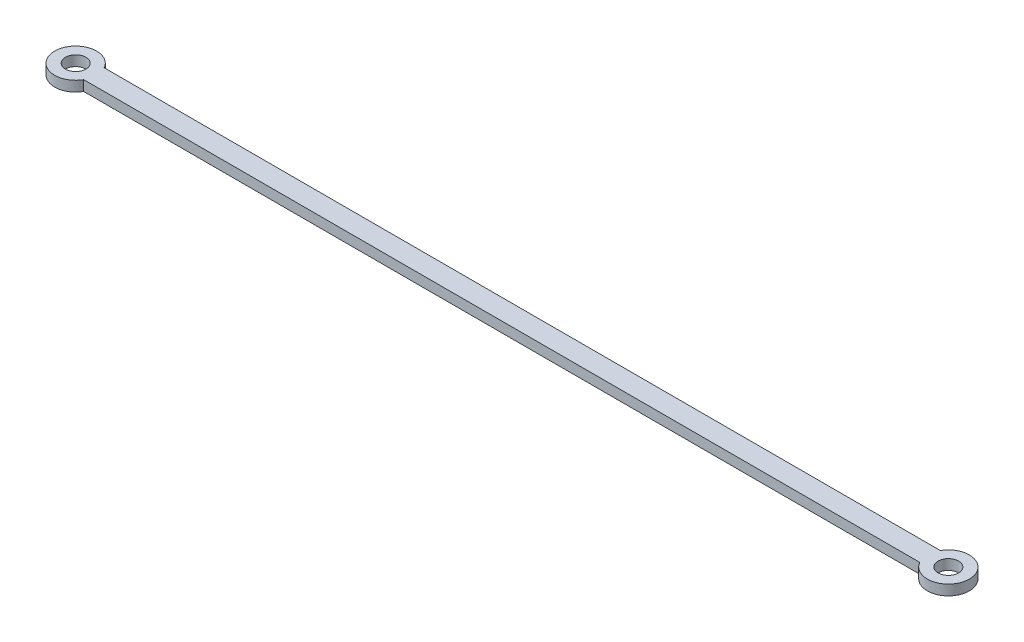
ISO-10303-21;
HEADER;
FILE_DESCRIPTION(('STEP AP214'),'2;1');
FILE_NAME('part.step','',(''),(''),'','','');
FILE_SCHEMA(('AUTOMOTIVE_DESIGN { 1 0 10303 214 1 1 1 1 }'));
ENDSEC;
DATA;
#1=APPLICATION_CONTEXT('core data for automotive mechanical design processes');
#2=APPLICATION_PROTOCOL_DEFINITION('international standard','automotive_design',2000,#1);
#3=PRODUCT_CONTEXT('',#1,'mechanical');
#4=PRODUCT('Part','Part','',(#3));
#5=PRODUCT_RELATED_PRODUCT_CATEGORY('part','',(#4));
#6=PRODUCT_DEFINITION_FORMATION('','',#4);
#7=PRODUCT_DEFINITION_CONTEXT('part definition',#1,'design');
#8=PRODUCT_DEFINITION('design','',#6,#7);
#9=PRODUCT_DEFINITION_SHAPE('','',#8);
#10=(LENGTH_UNIT() NAMED_UNIT(*) SI_UNIT(.MILLI.,.METRE.));
#11=(NAMED_UNIT(*) PLANE_ANGLE_UNIT() SI_UNIT($,.RADIAN.));
#12=(NAMED_UNIT(*) SI_UNIT($,.STERADIAN.) SOLID_ANGLE_UNIT());
#13=UNCERTAINTY_MEASURE_WITH_UNIT(LENGTH_MEASURE(1.E-05),#10,'distance_accuracy_value','');
#14=(GEOMETRIC_REPRESENTATION_CONTEXT(3) GLOBAL_UNCERTAINTY_ASSIGNED_CONTEXT((#13)) GLOBAL_UNIT_ASSIGNED_CONTEXT((#10,
#11,#12)) REPRESENTATION_CONTEXT('',''));
#15=CARTESIAN_POINT('',(0.,0.,0.));
#16=DIRECTION('',(0.,0.,1.));
#17=DIRECTION('',(1.,0.,0.));
#18=AXIS2_PLACEMENT_3D('',#15,#16,#17);
#19=CARTESIAN_POINT('',(850.134204652226,20.,-2.32225563181969E-13));
#20=DIRECTION('',(0.,-1.,0.));
#21=DIRECTION('',(0.,0.,-1.));
#22=AXIS2_PLACEMENT_3D('',#19,#20,#21);
#23=CYLINDRICAL_SURFACE('',#22,40.8631440444422);
#24=CARTESIAN_POINT('',(850.134204652226,0.,-2.32225563181969E-13));
#25=DIRECTION('',(0.,1.,0.));
#26=DIRECTION('',(0.,0.,1.));
#27=AXIS2_PLACEMENT_3D('',#24,#25,#26);
#28=CIRCLE('',#27,40.8631440444422);
#29=CARTESIAN_POINT('',(814.499999999999,0.,-20.));
#30=VERTEX_POINT('',#29);
#31=CARTESIAN_POINT('',(814.499999999999,0.,20.));
#32=VERTEX_POINT('',#31);
#33=EDGE_CURVE('E100',#30,#32,#28,.F.);
#34=ORIENTED_EDGE('',*,*,#33,.F.);
#35=DIRECTION('',(0.,-1.,0.));
#36=VECTOR('',#35,1.);
#37=CARTESIAN_POINT('',(814.499999999999,20.,-20.));
#38=LINE('',#37,#36);
#39=CARTESIAN_POINT('',(814.499999999999,20.,-20.));
#40=VERTEX_POINT('',#39);
#41=EDGE_CURVE('E60',#40,#30,#38,.T.);
#42=ORIENTED_EDGE('',*,*,#41,.F.);
#43=CARTESIAN_POINT('',(850.134204652226,20.,-2.32225563181969E-13));
#44=DIRECTION('',(0.,1.,0.));
#45=DIRECTION('',(0.,0.,1.));
#46=AXIS2_PLACEMENT_3D('',#43,#44,#45);
#47=CIRCLE('',#46,40.8631440444422);
#48=CARTESIAN_POINT('',(814.499999999999,20.,20.));
#49=VERTEX_POINT('',#48);
#50=EDGE_CURVE('E98',#40,#49,#47,.F.);
#51=ORIENTED_EDGE('',*,*,#50,.T.);
#52=DIRECTION('',(0.,-1.,0.));
#53=VECTOR('',#52,1.);
#54=CARTESIAN_POINT('',(814.499999999999,20.,20.));
#55=LINE('',#54,#53);
#56=EDGE_CURVE('E12',#49,#32,#55,.T.);
#57=ORIENTED_EDGE('',*,*,#56,.T.);
#58=EDGE_LOOP('',(#34,#42,#51,#57));
#59=FACE_BOUND('',#58,.T.);
#60=ADVANCED_FACE('F50',(#59),#23,.T.);
#61=CARTESIAN_POINT('',(0.,20.,-20.));
#62=DIRECTION('',(0.,0.,-1.));
#63=DIRECTION('',(-1.,0.,0.));
#64=AXIS2_PLACEMENT_3D('',#61,#62,#63);
#65=PLANE('',#64);
#66=DIRECTION('',(1.,0.,0.));
#67=VECTOR('',#66,1.);
#68=CARTESIAN_POINT('',(0.,0.,-20.));
#69=LINE('',#68,#67);
#70=CARTESIAN_POINT('',(-814.500000000001,0.,-20.));
#71=VERTEX_POINT('',#70);
#72=EDGE_CURVE('E119',#71,#30,#69,.T.);
#73=ORIENTED_EDGE('',*,*,#72,.F.);
#74=DIRECTION('',(0.,-1.,0.));
#75=VECTOR('',#74,1.);
#76=CARTESIAN_POINT('',(-814.500000000001,20.,-20.));
#77=LINE('',#76,#75);
#78=CARTESIAN_POINT('',(-814.500000000001,20.,-20.));
#79=VERTEX_POINT('',#78);
#80=EDGE_CURVE('E82',#79,#71,#77,.T.);
#81=ORIENTED_EDGE('',*,*,#80,.F.);
#82=DIRECTION('',(1.,0.,0.));
#83=VECTOR('',#82,1.);
#84=CARTESIAN_POINT('',(0.,20.,-20.));
#85=LINE('',#84,#83);
#86=EDGE_CURVE('E108',#79,#40,#85,.T.);
#87=ORIENTED_EDGE('',*,*,#86,.T.);
#88=ORIENTED_EDGE('',*,*,#41,.T.);
#89=EDGE_LOOP('',(#73,#81,#87,#88));
#90=FACE_BOUND('',#89,.T.);
#91=ADVANCED_FACE('F110',(#90),#65,.T.);
#92=CARTESIAN_POINT('',(0.,20.,20.));
#93=DIRECTION('',(0.,0.,-1.));
#94=DIRECTION('',(-1.,0.,0.));
#95=AXIS2_PLACEMENT_3D('',#92,#93,#94);
#96=PLANE('',#95);
#97=DIRECTION('',(1.,0.,0.));
#98=VECTOR('',#97,1.);
#99=CARTESIAN_POINT('',(0.,0.,20.));
#100=LINE('',#99,#98);
#101=CARTESIAN_POINT('',(-814.500000000001,0.,20.));
#102=VERTEX_POINT('',#101);
#103=EDGE_CURVE('E115',#102,#32,#100,.T.);
#104=ORIENTED_EDGE('',*,*,#103,.T.);
#105=ORIENTED_EDGE('',*,*,#56,.F.);
#106=DIRECTION('',(1.,0.,0.));
#107=VECTOR('',#106,1.);
#108=CARTESIAN_POINT('',(0.,20.,20.));
#109=LINE('',#108,#107);
#110=CARTESIAN_POINT('',(-814.500000000001,20.,20.));
#111=VERTEX_POINT('',#110);
#112=EDGE_CURVE('E92',#111,#49,#109,.T.);
#113=ORIENTED_EDGE('',*,*,#112,.F.);
#114=DIRECTION('',(0.,-1.,0.));
#115=VECTOR('',#114,1.);
#116=CARTESIAN_POINT('',(-814.500000000001,20.,20.));
#117=LINE('',#116,#115);
#118=EDGE_CURVE('E69',#111,#102,#117,.T.);
#119=ORIENTED_EDGE('',*,*,#118,.T.);
#120=EDGE_LOOP('',(#104,#105,#113,#119));
#121=FACE_BOUND('',#120,.T.);
#122=ADVANCED_FACE('F143',(#121),#96,.F.);
#123=CARTESIAN_POINT('',(0.,0.,0.));
#124=DIRECTION('',(0.,1.,0.));
#125=DIRECTION('',(0.,0.,1.));
#126=AXIS2_PLACEMENT_3D('',#123,#124,#125);
#127=PLANE('',#126);
#128=CARTESIAN_POINT('',(850.134204652226,0.,-2.32225563181969E-13));
#129=DIRECTION('',(0.,-1.,0.));
#130=DIRECTION('',(0.,0.,-1.));
#131=AXIS2_PLACEMENT_3D('',#128,#129,#130);
#132=CIRCLE('',#131,20.);
#133=CARTESIAN_POINT('',(850.134204652226,0.,-20.0000000000002));
#134=VERTEX_POINT('',#133);
#135=EDGE_CURVE('E121',#134,#134,#132,.T.);
#136=ORIENTED_EDGE('',*,*,#135,.F.);
#137=EDGE_LOOP('',(#136));
#138=FACE_BOUND('',#137,.T.);
#139=CARTESIAN_POINT('',(-850.134204652229,0.,0.));
#140=DIRECTION('',(0.,-1.,0.));
#141=DIRECTION('',(0.,0.,-1.));
#142=AXIS2_PLACEMENT_3D('',#139,#140,#141);
#143=CIRCLE('',#142,20.);
#144=CARTESIAN_POINT('',(-850.134204652229,0.,-20.));
#145=VERTEX_POINT('',#144);
#146=EDGE_CURVE('E134',#145,#145,#143,.T.);
#147=ORIENTED_EDGE('',*,*,#146,.F.);
#148=EDGE_LOOP('',(#147));
#149=FACE_BOUND('',#148,.T.);
#150=ORIENTED_EDGE('',*,*,#103,.F.);
#151=CARTESIAN_POINT('',(-850.134204652229,0.,0.));
#152=DIRECTION('',(0.,1.,0.));
#153=DIRECTION('',(0.,0.,1.));
#154=AXIS2_PLACEMENT_3D('',#151,#152,#153);
#155=CIRCLE('',#154,40.8631440444422);
#156=EDGE_CURVE('E54',#71,#102,#155,.T.);
#157=ORIENTED_EDGE('',*,*,#156,.F.);
#158=ORIENTED_EDGE('',*,*,#72,.T.);
#159=ORIENTED_EDGE('',*,*,#33,.T.);
#160=EDGE_LOOP('',(#150,#157,#158,#159));
#161=FACE_BOUND('',#160,.T.);
#162=ADVANCED_FACE('F140',(#138,#149,#161),#127,.F.);
#163=CARTESIAN_POINT('',(0.,20.,0.));
#164=DIRECTION('',(0.,1.,0.));
#165=DIRECTION('',(0.,0.,1.));
#166=AXIS2_PLACEMENT_3D('',#163,#164,#165);
#167=PLANE('',#166);
#168=CARTESIAN_POINT('',(850.134204652226,20.,-2.32225563181969E-13));
#169=DIRECTION('',(0.,1.,0.));
#170=DIRECTION('',(0.,0.,1.));
#171=AXIS2_PLACEMENT_3D('',#168,#169,#170);
#172=CIRCLE('',#171,20.);
#173=CARTESIAN_POINT('',(850.134204652226,20.,19.9999999999997));
#174=VERTEX_POINT('',#173);
#175=EDGE_CURVE('E124',#174,#174,#172,.F.);
#176=ORIENTED_EDGE('',*,*,#175,.T.);
#177=EDGE_LOOP('',(#176));
#178=FACE_BOUND('',#177,.T.);
#179=CARTESIAN_POINT('',(-850.134204652229,20.,0.));
#180=DIRECTION('',(0.,1.,0.));
#181=DIRECTION('',(0.,0.,1.));
#182=AXIS2_PLACEMENT_3D('',#179,#180,#181);
#183=CIRCLE('',#182,20.);
#184=CARTESIAN_POINT('',(-850.134204652229,20.,19.9999999999999));
#185=VERTEX_POINT('',#184);
#186=EDGE_CURVE('E129',#185,#185,#183,.F.);
#187=ORIENTED_EDGE('',*,*,#186,.T.);
#188=EDGE_LOOP('',(#187));
#189=FACE_BOUND('',#188,.T.);
#190=ORIENTED_EDGE('',*,*,#112,.T.);
#191=ORIENTED_EDGE('',*,*,#50,.F.);
#192=ORIENTED_EDGE('',*,*,#86,.F.);
#193=CARTESIAN_POINT('',(-850.134204652229,20.,0.));
#194=DIRECTION('',(0.,1.,0.));
#195=DIRECTION('',(0.,0.,1.));
#196=AXIS2_PLACEMENT_3D('',#193,#194,#195);
#197=CIRCLE('',#196,40.8631440444422);
#198=EDGE_CURVE('E117',#79,#111,#197,.T.);
#199=ORIENTED_EDGE('',*,*,#198,.T.);
#200=EDGE_LOOP('',(#190,#191,#192,#199));
#201=FACE_BOUND('',#200,.T.);
#202=ADVANCED_FACE('F107',(#178,#189,#201),#167,.T.);
#203=CARTESIAN_POINT('',(-850.134204652229,20.,0.));
#204=DIRECTION('',(0.,-1.,0.));
#205=DIRECTION('',(0.,0.,-1.));
#206=AXIS2_PLACEMENT_3D('',#203,#204,#205);
#207=CYLINDRICAL_SURFACE('',#206,40.8631440444422);
#208=ORIENTED_EDGE('',*,*,#156,.T.);
#209=ORIENTED_EDGE('',*,*,#118,.F.);
#210=ORIENTED_EDGE('',*,*,#198,.F.);
#211=ORIENTED_EDGE('',*,*,#80,.T.);
#212=EDGE_LOOP('',(#208,#209,#210,#211));
#213=FACE_BOUND('',#212,.T.);
#214=ADVANCED_FACE('F52',(#213),#207,.T.);
#215=CARTESIAN_POINT('',(-850.134204652229,20.001,0.));
#216=DIRECTION('',(0.,-1.,0.));
#217=DIRECTION('',(0.,0.,-1.));
#218=AXIS2_PLACEMENT_3D('',#215,#216,#217);
#219=CYLINDRICAL_SURFACE('',#218,20.);
#220=ORIENTED_EDGE('',*,*,#186,.F.);
#221=EDGE_LOOP('',(#220));
#222=FACE_BOUND('',#221,.T.);
#223=ORIENTED_EDGE('',*,*,#146,.T.);
#224=EDGE_LOOP('',(#223));
#225=FACE_BOUND('',#224,.T.);
#226=ADVANCED_FACE('F138',(#222,#225),#219,.F.);
#227=CARTESIAN_POINT('',(850.134204652226,20.001,-2.32225563181969E-13));
#228=DIRECTION('',(0.,-1.,0.));
#229=DIRECTION('',(0.,0.,-1.));
#230=AXIS2_PLACEMENT_3D('',#227,#228,#229);
#231=CYLINDRICAL_SURFACE('',#230,20.);
#232=ORIENTED_EDGE('',*,*,#175,.F.);
#233=EDGE_LOOP('',(#232));
#234=FACE_BOUND('',#233,.T.);
#235=ORIENTED_EDGE('',*,*,#135,.T.);
#236=EDGE_LOOP('',(#235));
#237=FACE_BOUND('',#236,.T.);
#238=ADVANCED_FACE('F161',(#234,#237),#231,.F.);
#239=CLOSED_SHELL('',(#60,#91,#122,#162,#202,#214,#226,#238));
#240=MANIFOLD_SOLID_BREP('B2',#239);
#241=ADVANCED_BREP_SHAPE_REPRESENTATION('',(#18,#240),#14);
#242=SHAPE_DEFINITION_REPRESENTATION(#9,#241);
ENDSEC;
END-ISO-10303-21;
